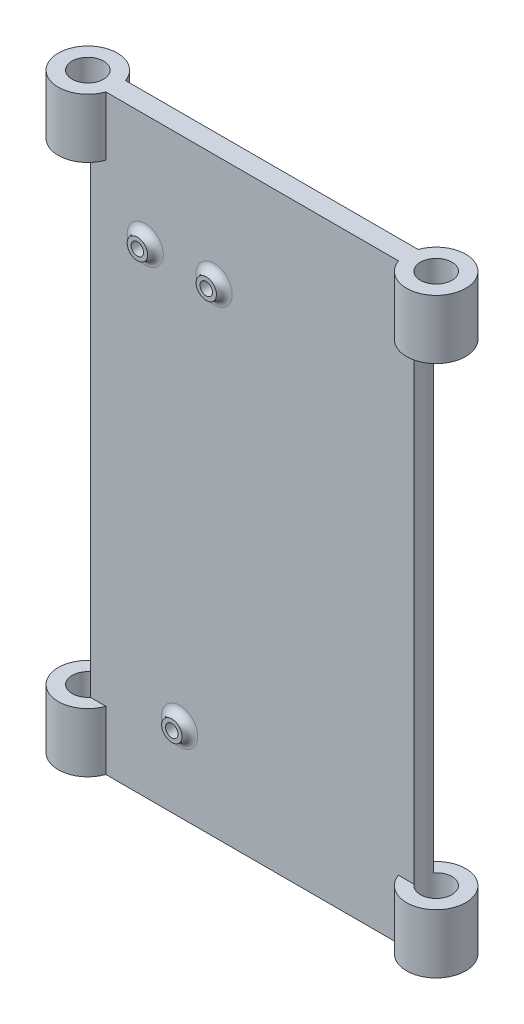
ISO-10303-21;
HEADER;
FILE_DESCRIPTION(('STEP AP214'),'2;1');
FILE_NAME('part.step','',(''),(''),'','','');
FILE_SCHEMA(('AUTOMOTIVE_DESIGN { 1 0 10303 214 1 1 1 1 }'));
ENDSEC;
DATA;
#1=APPLICATION_CONTEXT('core data for automotive mechanical design processes');
#2=APPLICATION_PROTOCOL_DEFINITION('international standard','automotive_design',2000,#1);
#3=PRODUCT_CONTEXT('',#1,'mechanical');
#4=PRODUCT('Part','Part','',(#3));
#5=PRODUCT_RELATED_PRODUCT_CATEGORY('part','',(#4));
#6=PRODUCT_DEFINITION_FORMATION('','',#4);
#7=PRODUCT_DEFINITION_CONTEXT('part definition',#1,'design');
#8=PRODUCT_DEFINITION('design','',#6,#7);
#9=PRODUCT_DEFINITION_SHAPE('','',#8);
#10=(LENGTH_UNIT() NAMED_UNIT(*) SI_UNIT(.MILLI.,.METRE.));
#11=(NAMED_UNIT(*) PLANE_ANGLE_UNIT() SI_UNIT($,.RADIAN.));
#12=(NAMED_UNIT(*) SI_UNIT($,.STERADIAN.) SOLID_ANGLE_UNIT());
#13=UNCERTAINTY_MEASURE_WITH_UNIT(LENGTH_MEASURE(1.E-05),#10,'distance_accuracy_value','');
#14=(GEOMETRIC_REPRESENTATION_CONTEXT(3) GLOBAL_UNCERTAINTY_ASSIGNED_CONTEXT((#13)) GLOBAL_UNIT_ASSIGNED_CONTEXT((#10,
#11,#12)) REPRESENTATION_CONTEXT('',''));
#15=CARTESIAN_POINT('',(0.,0.,0.));
#16=DIRECTION('',(0.,0.,1.));
#17=DIRECTION('',(1.,0.,0.));
#18=AXIS2_PLACEMENT_3D('',#15,#16,#17);
#19=CARTESIAN_POINT('',(0.,0.,5.));
#20=DIRECTION('',(0.,0.,-1.));
#21=DIRECTION('',(-1.,0.,0.));
#22=AXIS2_PLACEMENT_3D('',#19,#20,#21);
#23=PLANE('',#22);
#24=CARTESIAN_POINT('',(17.0710678118655,121.5,5.));
#25=DIRECTION('',(0.,0.,-1.));
#26=DIRECTION('',(-1.,0.,0.));
#27=AXIS2_PLACEMENT_3D('',#24,#25,#26);
#28=CIRCLE('',#27,4.58750000000001);
#29=CARTESIAN_POINT('',(12.4835678118655,121.5,5.));
#30=VERTEX_POINT('',#29);
#31=EDGE_CURVE('E11',#30,#30,#28,.T.);
#32=ORIENTED_EDGE('',*,*,#31,.T.);
#33=EDGE_LOOP('',(#32));
#34=FACE_BOUND('',#33,.T.);
#35=CARTESIAN_POINT('',(25.8110678118655,20.,5.));
#36=DIRECTION('',(0.,0.,-1.));
#37=DIRECTION('',(-1.,0.,0.));
#38=AXIS2_PLACEMENT_3D('',#35,#36,#37);
#39=CIRCLE('',#38,4.58750000000002);
#40=CARTESIAN_POINT('',(21.2235678118655,20.,5.));
#41=VERTEX_POINT('',#40);
#42=EDGE_CURVE('E47',#41,#41,#39,.T.);
#43=ORIENTED_EDGE('',*,*,#42,.T.);
#44=EDGE_LOOP('',(#43));
#45=FACE_BOUND('',#44,.T.);
#46=CARTESIAN_POINT('',(34.5510678118655,121.5,5.));
#47=DIRECTION('',(0.,0.,-1.));
#48=DIRECTION('',(-1.,0.,0.));
#49=AXIS2_PLACEMENT_3D('',#46,#47,#48);
#50=CIRCLE('',#49,4.58750000000001);
#51=CARTESIAN_POINT('',(29.9635678118655,121.5,5.));
#52=VERTEX_POINT('',#51);
#53=EDGE_CURVE('E209',#52,#52,#50,.T.);
#54=ORIENTED_EDGE('',*,*,#53,.T.);
#55=EDGE_LOOP('',(#54));
#56=FACE_BOUND('',#55,.T.);
#57=DIRECTION('',(1.,0.,0.));
#58=VECTOR('',#57,1.);
#59=CARTESIAN_POINT('',(0.,0.,5.));
#60=LINE('',#59,#58);
#61=CARTESIAN_POINT('',(7.07106781186548,0.,5.));
#62=VERTEX_POINT('',#61);
#63=CARTESIAN_POINT('',(81.3189321881345,0.,5.));
#64=VERTEX_POINT('',#63);
#65=EDGE_CURVE('E187',#62,#64,#60,.T.);
#66=ORIENTED_EDGE('',*,*,#65,.T.);
#67=DIRECTION('',(0.,-1.,0.));
#68=VECTOR('',#67,1.);
#69=CARTESIAN_POINT('',(81.3189321881345,15.,5.));
#70=LINE('',#69,#68);
#71=CARTESIAN_POINT('',(81.3189321881345,15.,5.));
#72=VERTEX_POINT('',#71);
#73=EDGE_CURVE('E257',#72,#64,#70,.T.);
#74=ORIENTED_EDGE('',*,*,#73,.F.);
#75=DIRECTION('',(1.,0.,0.));
#76=VECTOR('',#75,1.);
#77=CARTESIAN_POINT('',(81.3189321881345,15.,5.));
#78=LINE('',#77,#76);
#79=CARTESIAN_POINT('',(85.2675010008008,15.,5.));
#80=VERTEX_POINT('',#79);
#81=EDGE_CURVE('E251',#72,#80,#78,.T.);
#82=ORIENTED_EDGE('',*,*,#81,.T.);
#83=DIRECTION('',(0.,1.,0.));
#84=VECTOR('',#83,1.);
#85=CARTESIAN_POINT('',(85.2675010008008,150.,5.));
#86=LINE('',#85,#84);
#87=CARTESIAN_POINT('',(85.2675010008008,135.,5.));
#88=VERTEX_POINT('',#87);
#89=EDGE_CURVE('E137',#80,#88,#86,.T.);
#90=ORIENTED_EDGE('',*,*,#89,.T.);
#91=DIRECTION('',(1.,0.,0.));
#92=VECTOR('',#91,1.);
#93=CARTESIAN_POINT('',(0.,135.,5.));
#94=LINE('',#93,#92);
#95=CARTESIAN_POINT('',(81.3189321881345,135.,5.));
#96=VERTEX_POINT('',#95);
#97=EDGE_CURVE('E180',#96,#88,#94,.T.);
#98=ORIENTED_EDGE('',*,*,#97,.F.);
#99=DIRECTION('',(0.,1.,0.));
#100=VECTOR('',#99,1.);
#101=CARTESIAN_POINT('',(81.3189321881345,135.,5.));
#102=LINE('',#101,#100);
#103=CARTESIAN_POINT('',(81.3189321881345,150.,5.));
#104=VERTEX_POINT('',#103);
#105=EDGE_CURVE('E183',#96,#104,#102,.T.);
#106=ORIENTED_EDGE('',*,*,#105,.T.);
#107=DIRECTION('',(-1.,0.,0.));
#108=VECTOR('',#107,1.);
#109=CARTESIAN_POINT('',(0.,150.,5.));
#110=LINE('',#109,#108);
#111=CARTESIAN_POINT('',(7.07106781186548,150.,5.));
#112=VERTEX_POINT('',#111);
#113=EDGE_CURVE('E190',#104,#112,#110,.T.);
#114=ORIENTED_EDGE('',*,*,#113,.T.);
#115=DIRECTION('',(0.,1.,0.));
#116=VECTOR('',#115,1.);
#117=CARTESIAN_POINT('',(7.07106781186548,135.,5.));
#118=LINE('',#117,#116);
#119=CARTESIAN_POINT('',(7.07106781186548,135.,5.));
#120=VERTEX_POINT('',#119);
#121=EDGE_CURVE('E177',#112,#120,#118,.F.);
#122=ORIENTED_EDGE('',*,*,#121,.T.);
#123=DIRECTION('',(1.,0.,0.));
#124=VECTOR('',#123,1.);
#125=CARTESIAN_POINT('',(0.,135.,5.));
#126=LINE('',#125,#124);
#127=CARTESIAN_POINT('',(3.12249899919921,135.,5.));
#128=VERTEX_POINT('',#127);
#129=EDGE_CURVE('E169',#128,#120,#126,.T.);
#130=ORIENTED_EDGE('',*,*,#129,.F.);
#131=DIRECTION('',(0.,1.,0.));
#132=VECTOR('',#131,1.);
#133=CARTESIAN_POINT('',(3.12249899919921,150.,5.));
#134=LINE('',#133,#132);
#135=CARTESIAN_POINT('',(3.12249899919921,15.,5.));
#136=VERTEX_POINT('',#135);
#137=EDGE_CURVE('E162',#128,#136,#134,.F.);
#138=ORIENTED_EDGE('',*,*,#137,.T.);
#139=DIRECTION('',(1.,0.,0.));
#140=VECTOR('',#139,1.);
#141=CARTESIAN_POINT('',(3.1224989991992,15.,4.99999999999999));
#142=LINE('',#141,#140);
#143=CARTESIAN_POINT('',(7.07106781186548,15.,5.));
#144=VERTEX_POINT('',#143);
#145=EDGE_CURVE('E268',#136,#144,#142,.T.);
#146=ORIENTED_EDGE('',*,*,#145,.T.);
#147=DIRECTION('',(0.,-1.,0.));
#148=VECTOR('',#147,1.);
#149=CARTESIAN_POINT('',(7.07106781186548,15.,5.));
#150=LINE('',#149,#148);
#151=EDGE_CURVE('E261',#144,#62,#150,.T.);
#152=ORIENTED_EDGE('',*,*,#151,.T.);
#153=EDGE_LOOP('',(#66,#74,#82,#90,#98,#106,#114,#122,#130,#138,#146,#152));
#154=FACE_BOUND('',#153,.T.);
#155=ADVANCED_FACE('F39',(#34,#45,#56,#154),#23,.F.);
#156=CARTESIAN_POINT('',(88.39,150.,2.5));
#157=DIRECTION('',(0.,1.,0.));
#158=DIRECTION('',(0.,0.,1.));
#159=AXIS2_PLACEMENT_3D('',#156,#157,#158);
#160=CYLINDRICAL_SURFACE('',#159,4.);
#161=CARTESIAN_POINT('',(88.39,150.,2.5));
#162=DIRECTION('',(0.,1.,0.));
#163=DIRECTION('',(0.,0.,1.));
#164=AXIS2_PLACEMENT_3D('',#161,#162,#163);
#165=CIRCLE('',#164,4.00000000000002);
#166=CARTESIAN_POINT('',(88.39,150.,6.50000000000002));
#167=VERTEX_POINT('',#166);
#168=EDGE_CURVE('E157',#167,#167,#165,.T.);
#169=ORIENTED_EDGE('',*,*,#168,.T.);
#170=EDGE_LOOP('',(#169));
#171=FACE_BOUND('',#170,.T.);
#172=ORIENTED_EDGE('',*,*,#89,.F.);
#173=CARTESIAN_POINT('',(88.39,15.,2.5));
#174=DIRECTION('',(0.,-1.,0.));
#175=DIRECTION('',(0.,0.,-1.));
#176=AXIS2_PLACEMENT_3D('',#173,#174,#175);
#177=CIRCLE('',#176,4.00000000000002);
#178=CARTESIAN_POINT('',(85.2675010008008,15.,0.));
#179=VERTEX_POINT('',#178);
#180=EDGE_CURVE('E129',#179,#80,#177,.T.);
#181=ORIENTED_EDGE('',*,*,#180,.F.);
#182=DIRECTION('',(0.,1.,0.));
#183=VECTOR('',#182,1.);
#184=CARTESIAN_POINT('',(85.2675010008008,150.,0.));
#185=LINE('',#184,#183);
#186=CARTESIAN_POINT('',(85.2675010008008,135.,0.));
#187=VERTEX_POINT('',#186);
#188=EDGE_CURVE('E135',#179,#187,#185,.T.);
#189=ORIENTED_EDGE('',*,*,#188,.T.);
#190=CARTESIAN_POINT('',(88.39,135.,2.5));
#191=DIRECTION('',(0.,1.,0.));
#192=DIRECTION('',(0.,0.,1.));
#193=AXIS2_PLACEMENT_3D('',#190,#191,#192);
#194=CIRCLE('',#193,4.);
#195=EDGE_CURVE('E205',#88,#187,#194,.T.);
#196=ORIENTED_EDGE('',*,*,#195,.F.);
#197=EDGE_LOOP('',(#172,#181,#189,#196));
#198=FACE_BOUND('',#197,.T.);
#199=CARTESIAN_POINT('',(88.39,0.,2.5));
#200=DIRECTION('',(0.,1.,0.));
#201=DIRECTION('',(0.,0.,1.));
#202=AXIS2_PLACEMENT_3D('',#199,#200,#201);
#203=CIRCLE('',#202,4.00000000000002);
#204=CARTESIAN_POINT('',(88.39,0.,6.50000000000002));
#205=VERTEX_POINT('',#204);
#206=EDGE_CURVE('E213',#205,#205,#203,.T.);
#207=ORIENTED_EDGE('',*,*,#206,.F.);
#208=EDGE_LOOP('',(#207));
#209=FACE_BOUND('',#208,.T.);
#210=ADVANCED_FACE('F131',(#171,#198,#209),#160,.F.);
#211=CARTESIAN_POINT('',(0.,150.,2.5));
#212=DIRECTION('',(0.,1.,0.));
#213=DIRECTION('',(0.,0.,1.));
#214=AXIS2_PLACEMENT_3D('',#211,#212,#213);
#215=CYLINDRICAL_SURFACE('',#214,4.);
#216=CARTESIAN_POINT('',(0.,150.,2.5));
#217=DIRECTION('',(0.,1.,0.));
#218=DIRECTION('',(0.,0.,1.));
#219=AXIS2_PLACEMENT_3D('',#216,#217,#218);
#220=CIRCLE('',#219,4.00000000000001);
#221=CARTESIAN_POINT('',(0.,150.,6.50000000000001));
#222=VERTEX_POINT('',#221);
#223=EDGE_CURVE('E259',#222,#222,#220,.T.);
#224=ORIENTED_EDGE('',*,*,#223,.T.);
#225=EDGE_LOOP('',(#224));
#226=FACE_BOUND('',#225,.T.);
#227=DIRECTION('',(0.,1.,0.));
#228=VECTOR('',#227,1.);
#229=CARTESIAN_POINT('',(3.12249899919921,150.,0.));
#230=LINE('',#229,#228);
#231=CARTESIAN_POINT('',(3.12249899919921,135.,0.));
#232=VERTEX_POINT('',#231);
#233=CARTESIAN_POINT('',(3.12249899919919,15.,0.));
#234=VERTEX_POINT('',#233);
#235=EDGE_CURVE('E142',#232,#234,#230,.F.);
#236=ORIENTED_EDGE('',*,*,#235,.T.);
#237=CARTESIAN_POINT('',(0.,15.,2.5));
#238=DIRECTION('',(0.,-1.,0.));
#239=DIRECTION('',(0.,0.,-1.));
#240=AXIS2_PLACEMENT_3D('',#237,#238,#239);
#241=CIRCLE('',#240,4.00000000000001);
#242=EDGE_CURVE('E141',#136,#234,#241,.T.);
#243=ORIENTED_EDGE('',*,*,#242,.F.);
#244=ORIENTED_EDGE('',*,*,#137,.F.);
#245=CARTESIAN_POINT('',(0.,135.,2.5));
#246=DIRECTION('',(0.,1.,0.));
#247=DIRECTION('',(0.,0.,1.));
#248=AXIS2_PLACEMENT_3D('',#245,#246,#247);
#249=CIRCLE('',#248,4.);
#250=EDGE_CURVE('E54',#232,#128,#249,.T.);
#251=ORIENTED_EDGE('',*,*,#250,.F.);
#252=EDGE_LOOP('',(#236,#243,#244,#251));
#253=FACE_BOUND('',#252,.T.);
#254=CARTESIAN_POINT('',(0.,0.,2.5));
#255=DIRECTION('',(0.,1.,0.));
#256=DIRECTION('',(0.,0.,1.));
#257=AXIS2_PLACEMENT_3D('',#254,#255,#256);
#258=CIRCLE('',#257,4.00000000000001);
#259=CARTESIAN_POINT('',(0.,0.,6.50000000000001));
#260=VERTEX_POINT('',#259);
#261=EDGE_CURVE('E244',#260,#260,#258,.T.);
#262=ORIENTED_EDGE('',*,*,#261,.F.);
#263=EDGE_LOOP('',(#262));
#264=FACE_BOUND('',#263,.T.);
#265=ADVANCED_FACE('F281',(#226,#253,#264),#215,.F.);
#266=CARTESIAN_POINT('',(0.,150.,5.));
#267=DIRECTION('',(0.,-1.,0.));
#268=DIRECTION('',(0.,0.,-1.));
#269=AXIS2_PLACEMENT_3D('',#266,#267,#268);
#270=PLANE('',#269);
#271=ORIENTED_EDGE('',*,*,#223,.F.);
#272=EDGE_LOOP('',(#271));
#273=FACE_BOUND('',#272,.T.);
#274=ORIENTED_EDGE('',*,*,#113,.F.);
#275=CARTESIAN_POINT('',(88.39,150.,2.5));
#276=DIRECTION('',(0.,1.,0.));
#277=DIRECTION('',(0.,0.,1.));
#278=AXIS2_PLACEMENT_3D('',#275,#276,#277);
#279=CIRCLE('',#278,7.50000000000001);
#280=CARTESIAN_POINT('',(81.3189321881345,150.,0.));
#281=VERTEX_POINT('',#280);
#282=EDGE_CURVE('E62',#104,#281,#279,.T.);
#283=ORIENTED_EDGE('',*,*,#282,.T.);
#284=DIRECTION('',(-1.,0.,0.));
#285=VECTOR('',#284,1.);
#286=CARTESIAN_POINT('',(0.,150.,0.));
#287=LINE('',#286,#285);
#288=CARTESIAN_POINT('',(7.07106781186548,150.,0.));
#289=VERTEX_POINT('',#288);
#290=EDGE_CURVE('E191',#281,#289,#287,.T.);
#291=ORIENTED_EDGE('',*,*,#290,.T.);
#292=CARTESIAN_POINT('',(0.,150.,2.5));
#293=DIRECTION('',(0.,1.,0.));
#294=DIRECTION('',(0.,0.,1.));
#295=AXIS2_PLACEMENT_3D('',#292,#293,#294);
#296=CIRCLE('',#295,7.5);
#297=EDGE_CURVE('E171',#289,#112,#296,.T.);
#298=ORIENTED_EDGE('',*,*,#297,.T.);
#299=EDGE_LOOP('',(#274,#283,#291,#298));
#300=FACE_BOUND('',#299,.T.);
#301=ORIENTED_EDGE('',*,*,#168,.F.);
#302=EDGE_LOOP('',(#301));
#303=FACE_BOUND('',#302,.T.);
#304=ADVANCED_FACE('F291',(#273,#300,#303),#270,.F.);
#305=CARTESIAN_POINT('',(0.,0.,5.));
#306=DIRECTION('',(0.,1.,0.));
#307=DIRECTION('',(0.,0.,1.));
#308=AXIS2_PLACEMENT_3D('',#305,#306,#307);
#309=PLANE('',#308);
#310=ORIENTED_EDGE('',*,*,#261,.T.);
#311=EDGE_LOOP('',(#310));
#312=FACE_BOUND('',#311,.T.);
#313=ORIENTED_EDGE('',*,*,#206,.T.);
#314=EDGE_LOOP('',(#313));
#315=FACE_BOUND('',#314,.T.);
#316=ORIENTED_EDGE('',*,*,#65,.F.);
#317=CARTESIAN_POINT('',(0.,0.,2.5));
#318=DIRECTION('',(0.,-1.,0.));
#319=DIRECTION('',(0.,0.,-1.));
#320=AXIS2_PLACEMENT_3D('',#317,#318,#319);
#321=CIRCLE('',#320,7.5);
#322=CARTESIAN_POINT('',(7.07106781186548,0.,0.));
#323=VERTEX_POINT('',#322);
#324=EDGE_CURVE('E256',#62,#323,#321,.T.);
#325=ORIENTED_EDGE('',*,*,#324,.T.);
#326=DIRECTION('',(1.,0.,0.));
#327=VECTOR('',#326,1.);
#328=CARTESIAN_POINT('',(0.,0.,0.));
#329=LINE('',#328,#327);
#330=CARTESIAN_POINT('',(81.3189321881345,0.,0.));
#331=VERTEX_POINT('',#330);
#332=EDGE_CURVE('E186',#323,#331,#329,.T.);
#333=ORIENTED_EDGE('',*,*,#332,.T.);
#334=CARTESIAN_POINT('',(88.39,0.,2.5));
#335=DIRECTION('',(0.,-1.,0.));
#336=DIRECTION('',(0.,0.,-1.));
#337=AXIS2_PLACEMENT_3D('',#334,#335,#336);
#338=CIRCLE('',#337,7.50000000000002);
#339=EDGE_CURVE('E151',#331,#64,#338,.T.);
#340=ORIENTED_EDGE('',*,*,#339,.T.);
#341=EDGE_LOOP('',(#316,#325,#333,#340));
#342=FACE_BOUND('',#341,.T.);
#343=ADVANCED_FACE('F326',(#312,#315,#342),#309,.F.);
#344=CARTESIAN_POINT('',(0.,0.,0.));
#345=DIRECTION('',(0.,0.,-1.));
#346=DIRECTION('',(-1.,0.,0.));
#347=AXIS2_PLACEMENT_3D('',#344,#345,#346);
#348=PLANE('',#347);
#349=CARTESIAN_POINT('',(17.0710678118655,121.5,0.));
#350=DIRECTION('',(0.,0.,-1.));
#351=DIRECTION('',(-1.,0.,0.));
#352=AXIS2_PLACEMENT_3D('',#349,#350,#351);
#353=CIRCLE('',#352,1.58750000000001);
#354=CARTESIAN_POINT('',(15.4835678118655,121.5,0.));
#355=VERTEX_POINT('',#354);
#356=EDGE_CURVE('E217',#355,#355,#353,.T.);
#357=ORIENTED_EDGE('',*,*,#356,.F.);
#358=EDGE_LOOP('',(#357));
#359=FACE_BOUND('',#358,.T.);
#360=CARTESIAN_POINT('',(34.5510678118655,121.5,0.));
#361=DIRECTION('',(0.,0.,-1.));
#362=DIRECTION('',(-1.,0.,0.));
#363=AXIS2_PLACEMENT_3D('',#360,#361,#362);
#364=CIRCLE('',#363,1.58750000000001);
#365=CARTESIAN_POINT('',(32.9635678118655,121.5,0.));
#366=VERTEX_POINT('',#365);
#367=EDGE_CURVE('E214',#366,#366,#364,.T.);
#368=ORIENTED_EDGE('',*,*,#367,.F.);
#369=EDGE_LOOP('',(#368));
#370=FACE_BOUND('',#369,.T.);
#371=CARTESIAN_POINT('',(25.8110678118655,20.,0.));
#372=DIRECTION('',(0.,0.,-1.));
#373=DIRECTION('',(-1.,0.,0.));
#374=AXIS2_PLACEMENT_3D('',#371,#372,#373);
#375=CIRCLE('',#374,1.58750000000001);
#376=CARTESIAN_POINT('',(24.2235678118655,20.,0.));
#377=VERTEX_POINT('',#376);
#378=EDGE_CURVE('E210',#377,#377,#375,.T.);
#379=ORIENTED_EDGE('',*,*,#378,.F.);
#380=EDGE_LOOP('',(#379));
#381=FACE_BOUND('',#380,.T.);
#382=DIRECTION('',(0.,-1.,0.));
#383=VECTOR('',#382,1.);
#384=CARTESIAN_POINT('',(81.3189321881345,15.,0.));
#385=LINE('',#384,#383);
#386=CARTESIAN_POINT('',(81.3189321881345,15.,0.));
#387=VERTEX_POINT('',#386);
#388=EDGE_CURVE('E253',#387,#331,#385,.T.);
#389=ORIENTED_EDGE('',*,*,#388,.T.);
#390=ORIENTED_EDGE('',*,*,#332,.F.);
#391=DIRECTION('',(0.,-1.,0.));
#392=VECTOR('',#391,1.);
#393=CARTESIAN_POINT('',(7.07106781186548,15.,0.));
#394=LINE('',#393,#392);
#395=CARTESIAN_POINT('',(7.07106781186548,15.,0.));
#396=VERTEX_POINT('',#395);
#397=EDGE_CURVE('E247',#396,#323,#394,.T.);
#398=ORIENTED_EDGE('',*,*,#397,.F.);
#399=DIRECTION('',(-1.,0.,0.));
#400=VECTOR('',#399,1.);
#401=CARTESIAN_POINT('',(3.12249899919919,15.,0.));
#402=LINE('',#401,#400);
#403=EDGE_CURVE('E264',#396,#234,#402,.T.);
#404=ORIENTED_EDGE('',*,*,#403,.T.);
#405=ORIENTED_EDGE('',*,*,#235,.F.);
#406=DIRECTION('',(1.,0.,0.));
#407=VECTOR('',#406,1.);
#408=CARTESIAN_POINT('',(0.,135.,0.));
#409=LINE('',#408,#407);
#410=CARTESIAN_POINT('',(7.07106781186548,135.,0.));
#411=VERTEX_POINT('',#410);
#412=EDGE_CURVE('E194',#232,#411,#409,.T.);
#413=ORIENTED_EDGE('',*,*,#412,.T.);
#414=DIRECTION('',(0.,1.,0.));
#415=VECTOR('',#414,1.);
#416=CARTESIAN_POINT('',(7.07106781186548,135.,0.));
#417=LINE('',#416,#415);
#418=EDGE_CURVE('E199',#289,#411,#417,.F.);
#419=ORIENTED_EDGE('',*,*,#418,.F.);
#420=ORIENTED_EDGE('',*,*,#290,.F.);
#421=DIRECTION('',(0.,1.,0.));
#422=VECTOR('',#421,1.);
#423=CARTESIAN_POINT('',(81.3189321881345,135.,0.));
#424=LINE('',#423,#422);
#425=CARTESIAN_POINT('',(81.3189321881345,135.,0.));
#426=VERTEX_POINT('',#425);
#427=EDGE_CURVE('E203',#426,#281,#424,.T.);
#428=ORIENTED_EDGE('',*,*,#427,.F.);
#429=DIRECTION('',(1.,0.,0.));
#430=VECTOR('',#429,1.);
#431=CARTESIAN_POINT('',(0.,135.,0.));
#432=LINE('',#431,#430);
#433=EDGE_CURVE('E156',#426,#187,#432,.T.);
#434=ORIENTED_EDGE('',*,*,#433,.T.);
#435=ORIENTED_EDGE('',*,*,#188,.F.);
#436=DIRECTION('',(-1.,0.,0.));
#437=VECTOR('',#436,1.);
#438=CARTESIAN_POINT('',(81.3189321881345,15.,0.));
#439=LINE('',#438,#437);
#440=EDGE_CURVE('E146',#179,#387,#439,.T.);
#441=ORIENTED_EDGE('',*,*,#440,.T.);
#442=EDGE_LOOP('',(#389,#390,#398,#404,#405,#413,#419,#420,#428,#434,#435,#441));
#443=FACE_BOUND('',#442,.T.);
#444=ADVANCED_FACE('F154',(#359,#370,#381,#443),#348,.T.);
#445=CARTESIAN_POINT('',(0.,135.,2.5));
#446=DIRECTION('',(0.,1.,0.));
#447=DIRECTION('',(0.,0.,1.));
#448=AXIS2_PLACEMENT_3D('',#445,#446,#447);
#449=CYLINDRICAL_SURFACE('',#448,7.5);
#450=ORIENTED_EDGE('',*,*,#121,.F.);
#451=ORIENTED_EDGE('',*,*,#297,.F.);
#452=ORIENTED_EDGE('',*,*,#418,.T.);
#453=CARTESIAN_POINT('',(0.,135.,2.5));
#454=DIRECTION('',(0.,1.,0.));
#455=DIRECTION('',(0.,0.,1.));
#456=AXIS2_PLACEMENT_3D('',#453,#454,#455);
#457=CIRCLE('',#456,7.5);
#458=EDGE_CURVE('E159',#411,#120,#457,.T.);
#459=ORIENTED_EDGE('',*,*,#458,.T.);
#460=EDGE_LOOP('',(#450,#451,#452,#459));
#461=FACE_BOUND('',#460,.T.);
#462=ADVANCED_FACE('F290',(#461),#449,.T.);
#463=CARTESIAN_POINT('',(0.,135.,2.5));
#464=DIRECTION('',(0.,1.,0.));
#465=DIRECTION('',(0.,0.,1.));
#466=AXIS2_PLACEMENT_3D('',#463,#464,#465);
#467=PLANE('',#466);
#468=ORIENTED_EDGE('',*,*,#412,.F.);
#469=ORIENTED_EDGE('',*,*,#250,.T.);
#470=ORIENTED_EDGE('',*,*,#129,.T.);
#471=ORIENTED_EDGE('',*,*,#458,.F.);
#472=EDGE_LOOP('',(#468,#469,#470,#471));
#473=FACE_BOUND('',#472,.T.);
#474=ADVANCED_FACE('F285',(#473),#467,.F.);
#475=CARTESIAN_POINT('',(88.39,135.,2.5));
#476=DIRECTION('',(0.,1.,0.));
#477=DIRECTION('',(0.,0.,1.));
#478=AXIS2_PLACEMENT_3D('',#475,#476,#477);
#479=CYLINDRICAL_SURFACE('',#478,7.50000000000001);
#480=ORIENTED_EDGE('',*,*,#105,.F.);
#481=CARTESIAN_POINT('',(88.39,135.,2.5));
#482=DIRECTION('',(0.,1.,0.));
#483=DIRECTION('',(0.,0.,1.));
#484=AXIS2_PLACEMENT_3D('',#481,#482,#483);
#485=CIRCLE('',#484,7.50000000000001);
#486=EDGE_CURVE('E166',#96,#426,#485,.T.);
#487=ORIENTED_EDGE('',*,*,#486,.T.);
#488=ORIENTED_EDGE('',*,*,#427,.T.);
#489=ORIENTED_EDGE('',*,*,#282,.F.);
#490=EDGE_LOOP('',(#480,#487,#488,#489));
#491=FACE_BOUND('',#490,.T.);
#492=ADVANCED_FACE('F296',(#491),#479,.T.);
#493=CARTESIAN_POINT('',(88.39,135.,2.5));
#494=DIRECTION('',(0.,1.,0.));
#495=DIRECTION('',(0.,0.,1.));
#496=AXIS2_PLACEMENT_3D('',#493,#494,#495);
#497=PLANE('',#496);
#498=ORIENTED_EDGE('',*,*,#97,.T.);
#499=ORIENTED_EDGE('',*,*,#195,.T.);
#500=ORIENTED_EDGE('',*,*,#433,.F.);
#501=ORIENTED_EDGE('',*,*,#486,.F.);
#502=EDGE_LOOP('',(#498,#499,#500,#501));
#503=FACE_BOUND('',#502,.T.);
#504=ADVANCED_FACE('F298',(#503),#497,.F.);
#505=CARTESIAN_POINT('',(0.,15.,2.5));
#506=DIRECTION('',(0.,-1.,0.));
#507=DIRECTION('',(0.,0.,-1.));
#508=AXIS2_PLACEMENT_3D('',#505,#506,#507);
#509=CYLINDRICAL_SURFACE('',#508,7.5);
#510=ORIENTED_EDGE('',*,*,#324,.F.);
#511=ORIENTED_EDGE('',*,*,#151,.F.);
#512=CARTESIAN_POINT('',(0.,15.,2.5));
#513=DIRECTION('',(0.,-1.,0.));
#514=DIRECTION('',(0.,0.,-1.));
#515=AXIS2_PLACEMENT_3D('',#512,#513,#514);
#516=CIRCLE('',#515,7.5);
#517=EDGE_CURVE('E271',#144,#396,#516,.T.);
#518=ORIENTED_EDGE('',*,*,#517,.T.);
#519=ORIENTED_EDGE('',*,*,#397,.T.);
#520=EDGE_LOOP('',(#510,#511,#518,#519));
#521=FACE_BOUND('',#520,.T.);
#522=ADVANCED_FACE('F300',(#521),#509,.T.);
#523=CARTESIAN_POINT('',(0.,15.,2.5));
#524=DIRECTION('',(0.,-1.,0.));
#525=DIRECTION('',(0.,0.,-1.));
#526=AXIS2_PLACEMENT_3D('',#523,#524,#525);
#527=PLANE('',#526);
#528=ORIENTED_EDGE('',*,*,#145,.F.);
#529=ORIENTED_EDGE('',*,*,#242,.T.);
#530=ORIENTED_EDGE('',*,*,#403,.F.);
#531=ORIENTED_EDGE('',*,*,#517,.F.);
#532=EDGE_LOOP('',(#528,#529,#530,#531));
#533=FACE_BOUND('',#532,.T.);
#534=ADVANCED_FACE('F306',(#533),#527,.F.);
#535=CARTESIAN_POINT('',(88.39,15.,2.5));
#536=DIRECTION('',(0.,-1.,0.));
#537=DIRECTION('',(0.,0.,-1.));
#538=AXIS2_PLACEMENT_3D('',#535,#536,#537);
#539=CYLINDRICAL_SURFACE('',#538,7.50000000000002);
#540=ORIENTED_EDGE('',*,*,#339,.F.);
#541=ORIENTED_EDGE('',*,*,#388,.F.);
#542=CARTESIAN_POINT('',(88.39,15.,2.5));
#543=DIRECTION('',(0.,-1.,0.));
#544=DIRECTION('',(0.,0.,-1.));
#545=AXIS2_PLACEMENT_3D('',#542,#543,#544);
#546=CIRCLE('',#545,7.50000000000002);
#547=EDGE_CURVE('E148',#387,#72,#546,.T.);
#548=ORIENTED_EDGE('',*,*,#547,.T.);
#549=ORIENTED_EDGE('',*,*,#73,.T.);
#550=EDGE_LOOP('',(#540,#541,#548,#549));
#551=FACE_BOUND('',#550,.T.);
#552=ADVANCED_FACE('F378',(#551),#539,.T.);
#553=CARTESIAN_POINT('',(88.39,15.,2.5));
#554=DIRECTION('',(0.,-1.,0.));
#555=DIRECTION('',(0.,0.,-1.));
#556=AXIS2_PLACEMENT_3D('',#553,#554,#555);
#557=PLANE('',#556);
#558=ORIENTED_EDGE('',*,*,#440,.F.);
#559=ORIENTED_EDGE('',*,*,#180,.T.);
#560=ORIENTED_EDGE('',*,*,#81,.F.);
#561=ORIENTED_EDGE('',*,*,#547,.F.);
#562=EDGE_LOOP('',(#558,#559,#560,#561));
#563=FACE_BOUND('',#562,.T.);
#564=ADVANCED_FACE('F147',(#563),#557,.F.);
#565=CARTESIAN_POINT('',(25.8110678118655,20.,5.));
#566=DIRECTION('',(0.,0.,1.));
#567=DIRECTION('',(1.,0.,0.));
#568=AXIS2_PLACEMENT_3D('',#565,#566,#567);
#569=CYLINDRICAL_SURFACE('',#568,1.58750000000001);
#570=ORIENTED_EDGE('',*,*,#378,.T.);
#571=EDGE_LOOP('',(#570));
#572=FACE_BOUND('',#571,.T.);
#573=CARTESIAN_POINT('',(25.8110678118655,20.,7.));
#574=DIRECTION('',(0.,0.,1.));
#575=DIRECTION('',(1.,0.,0.));
#576=AXIS2_PLACEMENT_3D('',#573,#574,#575);
#577=CIRCLE('',#576,1.58750000000002);
#578=CARTESIAN_POINT('',(27.3985678118655,20.,7.));
#579=VERTEX_POINT('',#578);
#580=EDGE_CURVE('E235',#579,#579,#577,.T.);
#581=ORIENTED_EDGE('',*,*,#580,.T.);
#582=EDGE_LOOP('',(#581));
#583=FACE_BOUND('',#582,.T.);
#584=ADVANCED_FACE('F371',(#572,#583),#569,.F.);
#585=CARTESIAN_POINT('',(34.5510678118655,121.5,5.));
#586=DIRECTION('',(0.,0.,1.));
#587=DIRECTION('',(1.,0.,0.));
#588=AXIS2_PLACEMENT_3D('',#585,#586,#587);
#589=CYLINDRICAL_SURFACE('',#588,1.58750000000001);
#590=ORIENTED_EDGE('',*,*,#367,.T.);
#591=EDGE_LOOP('',(#590));
#592=FACE_BOUND('',#591,.T.);
#593=CARTESIAN_POINT('',(34.5510678118655,121.5,7.));
#594=DIRECTION('',(0.,0.,1.));
#595=DIRECTION('',(1.,0.,0.));
#596=AXIS2_PLACEMENT_3D('',#593,#594,#595);
#597=CIRCLE('',#596,1.58750000000001);
#598=CARTESIAN_POINT('',(36.1385678118655,121.5,7.));
#599=VERTEX_POINT('',#598);
#600=EDGE_CURVE('E241',#599,#599,#597,.T.);
#601=ORIENTED_EDGE('',*,*,#600,.T.);
#602=EDGE_LOOP('',(#601));
#603=FACE_BOUND('',#602,.T.);
#604=ADVANCED_FACE('F355',(#592,#603),#589,.F.);
#605=CARTESIAN_POINT('',(17.0710678118655,121.5,5.));
#606=DIRECTION('',(0.,0.,1.));
#607=DIRECTION('',(1.,0.,0.));
#608=AXIS2_PLACEMENT_3D('',#605,#606,#607);
#609=CYLINDRICAL_SURFACE('',#608,1.58750000000001);
#610=ORIENTED_EDGE('',*,*,#356,.T.);
#611=EDGE_LOOP('',(#610));
#612=FACE_BOUND('',#611,.T.);
#613=CARTESIAN_POINT('',(17.0710678118655,121.5,7.));
#614=DIRECTION('',(0.,0.,1.));
#615=DIRECTION('',(1.,0.,0.));
#616=AXIS2_PLACEMENT_3D('',#613,#614,#615);
#617=CIRCLE('',#616,1.58750000000002);
#618=CARTESIAN_POINT('',(18.6585678118655,121.5,7.));
#619=VERTEX_POINT('',#618);
#620=EDGE_CURVE('E345',#619,#619,#617,.T.);
#621=ORIENTED_EDGE('',*,*,#620,.T.);
#622=EDGE_LOOP('',(#621));
#623=FACE_BOUND('',#622,.T.);
#624=ADVANCED_FACE('F363',(#612,#623),#609,.F.);
#625=CARTESIAN_POINT('',(17.0710678118655,121.5,7.));
#626=DIRECTION('',(0.,0.,1.));
#627=DIRECTION('',(1.,0.,0.));
#628=AXIS2_PLACEMENT_3D('',#625,#626,#627);
#629=PLANE('',#628);
#630=CARTESIAN_POINT('',(17.0710678118655,121.5,7.));
#631=DIRECTION('',(0.,0.,1.));
#632=DIRECTION('',(1.,0.,0.));
#633=AXIS2_PLACEMENT_3D('',#630,#631,#632);
#634=CIRCLE('',#633,2.58750000000001);
#635=CARTESIAN_POINT('',(19.6585678118655,121.5,7.));
#636=VERTEX_POINT('',#635);
#637=EDGE_CURVE('E220',#636,#636,#634,.T.);
#638=ORIENTED_EDGE('',*,*,#637,.T.);
#639=EDGE_LOOP('',(#638));
#640=FACE_BOUND('',#639,.T.);
#641=ORIENTED_EDGE('',*,*,#620,.F.);
#642=EDGE_LOOP('',(#641));
#643=FACE_BOUND('',#642,.T.);
#644=ADVANCED_FACE('F358',(#640,#643),#629,.T.);
#645=CARTESIAN_POINT('',(34.5510678118655,121.5,7.));
#646=DIRECTION('',(0.,0.,1.));
#647=DIRECTION('',(1.,0.,0.));
#648=AXIS2_PLACEMENT_3D('',#645,#646,#647);
#649=PLANE('',#648);
#650=CARTESIAN_POINT('',(34.5510678118655,121.5,7.));
#651=DIRECTION('',(0.,0.,1.));
#652=DIRECTION('',(1.,0.,0.));
#653=AXIS2_PLACEMENT_3D('',#650,#651,#652);
#654=CIRCLE('',#653,2.58750000000001);
#655=CARTESIAN_POINT('',(37.1385678118655,121.5,7.));
#656=VERTEX_POINT('',#655);
#657=EDGE_CURVE('E238',#656,#656,#654,.T.);
#658=ORIENTED_EDGE('',*,*,#657,.T.);
#659=EDGE_LOOP('',(#658));
#660=FACE_BOUND('',#659,.T.);
#661=ORIENTED_EDGE('',*,*,#600,.F.);
#662=EDGE_LOOP('',(#661));
#663=FACE_BOUND('',#662,.T.);
#664=ADVANCED_FACE('F338',(#660,#663),#649,.T.);
#665=CARTESIAN_POINT('',(25.8110678118655,20.,7.));
#666=DIRECTION('',(0.,0.,1.));
#667=DIRECTION('',(1.,0.,0.));
#668=AXIS2_PLACEMENT_3D('',#665,#666,#667);
#669=PLANE('',#668);
#670=CARTESIAN_POINT('',(25.8110678118655,20.,7.));
#671=DIRECTION('',(0.,0.,1.));
#672=DIRECTION('',(1.,0.,0.));
#673=AXIS2_PLACEMENT_3D('',#670,#671,#672);
#674=CIRCLE('',#673,2.58750000000002);
#675=CARTESIAN_POINT('',(28.3985678118655,20.,7.));
#676=VERTEX_POINT('',#675);
#677=EDGE_CURVE('E233',#676,#676,#674,.T.);
#678=ORIENTED_EDGE('',*,*,#677,.T.);
#679=EDGE_LOOP('',(#678));
#680=FACE_BOUND('',#679,.T.);
#681=ORIENTED_EDGE('',*,*,#580,.F.);
#682=EDGE_LOOP('',(#681));
#683=FACE_BOUND('',#682,.T.);
#684=ADVANCED_FACE('F334',(#680,#683),#669,.T.);
#685=CARTESIAN_POINT('',(17.0710678118655,121.5,7.));
#686=DIRECTION('',(0.,0.,-1.));
#687=DIRECTION('',(-1.,0.,0.));
#688=AXIS2_PLACEMENT_3D('',#685,#686,#687);
#689=TOROIDAL_SURFACE('',#688,4.58750000000001,2.);
#690=ORIENTED_EDGE('',*,*,#31,.F.);
#691=EDGE_LOOP('',(#690));
#692=FACE_BOUND('',#691,.T.);
#693=ORIENTED_EDGE('',*,*,#637,.F.);
#694=EDGE_LOOP('',(#693));
#695=FACE_BOUND('',#694,.T.);
#696=ADVANCED_FACE('F230',(#692,#695),#689,.F.);
#697=CARTESIAN_POINT('',(25.8110678118655,20.,7.));
#698=DIRECTION('',(0.,0.,-1.));
#699=DIRECTION('',(-1.,0.,0.));
#700=AXIS2_PLACEMENT_3D('',#697,#698,#699);
#701=TOROIDAL_SURFACE('',#700,4.58750000000002,2.);
#702=ORIENTED_EDGE('',*,*,#42,.F.);
#703=EDGE_LOOP('',(#702));
#704=FACE_BOUND('',#703,.T.);
#705=ORIENTED_EDGE('',*,*,#677,.F.);
#706=EDGE_LOOP('',(#705));
#707=FACE_BOUND('',#706,.T.);
#708=ADVANCED_FACE('F227',(#704,#707),#701,.F.);
#709=CARTESIAN_POINT('',(34.5510678118655,121.5,7.));
#710=DIRECTION('',(0.,0.,-1.));
#711=DIRECTION('',(-1.,0.,0.));
#712=AXIS2_PLACEMENT_3D('',#709,#710,#711);
#713=TOROIDAL_SURFACE('',#712,4.58750000000001,2.);
#714=ORIENTED_EDGE('',*,*,#53,.F.);
#715=EDGE_LOOP('',(#714));
#716=FACE_BOUND('',#715,.T.);
#717=ORIENTED_EDGE('',*,*,#657,.F.);
#718=EDGE_LOOP('',(#717));
#719=FACE_BOUND('',#718,.T.);
#720=ADVANCED_FACE('F41',(#716,#719),#713,.F.);
#721=CLOSED_SHELL('',(#155,#210,#265,#304,#343,#444,#462,#474,#492,#504,#522,#534,#552,#564,
#584,#604,#624,#644,#664,#684,#696,#708,#720));
#722=MANIFOLD_SOLID_BREP('B2',#721);
#723=ADVANCED_BREP_SHAPE_REPRESENTATION('',(#18,#722),#14);
#724=SHAPE_DEFINITION_REPRESENTATION(#9,#723);
ENDSEC;
END-ISO-10303-21;
